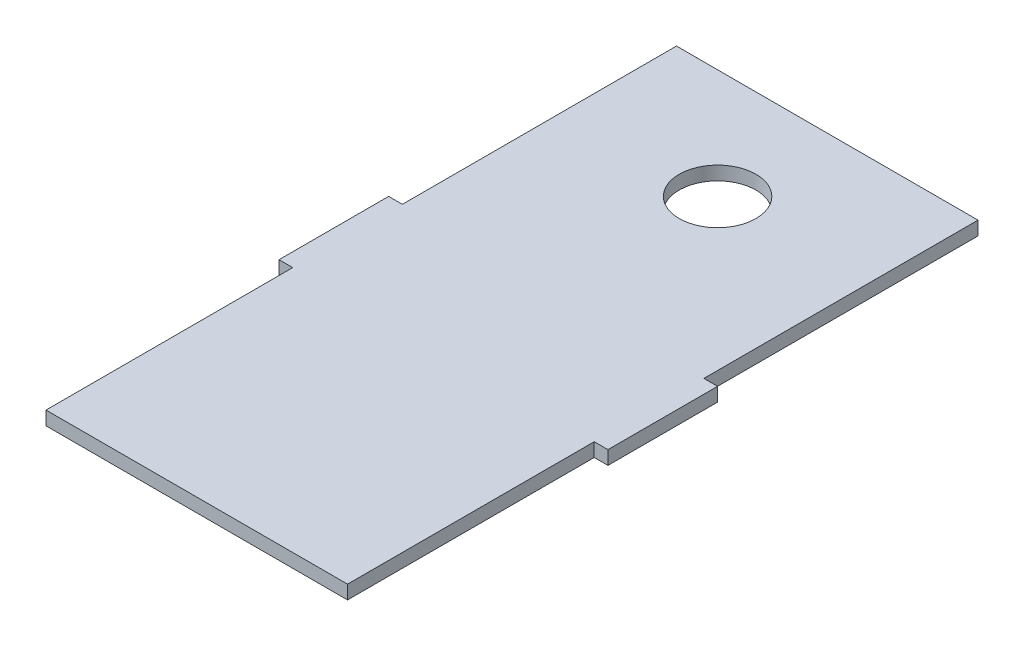
ISO-10303-21;
HEADER;
FILE_DESCRIPTION(('STEP AP214'),'2;1');
FILE_NAME('part.step','',(''),(''),'','','');
FILE_SCHEMA(('AUTOMOTIVE_DESIGN { 1 0 10303 214 1 1 1 1 }'));
ENDSEC;
DATA;
#1=APPLICATION_CONTEXT('core data for automotive mechanical design processes');
#2=APPLICATION_PROTOCOL_DEFINITION('international standard','automotive_design',2000,#1);
#3=PRODUCT_CONTEXT('',#1,'mechanical');
#4=PRODUCT('Part','Part','',(#3));
#5=PRODUCT_RELATED_PRODUCT_CATEGORY('part','',(#4));
#6=PRODUCT_DEFINITION_FORMATION('','',#4);
#7=PRODUCT_DEFINITION_CONTEXT('part definition',#1,'design');
#8=PRODUCT_DEFINITION('design','',#6,#7);
#9=PRODUCT_DEFINITION_SHAPE('','',#8);
#10=(LENGTH_UNIT() NAMED_UNIT(*) SI_UNIT(.MILLI.,.METRE.));
#11=(NAMED_UNIT(*) PLANE_ANGLE_UNIT() SI_UNIT($,.RADIAN.));
#12=(NAMED_UNIT(*) SI_UNIT($,.STERADIAN.) SOLID_ANGLE_UNIT());
#13=UNCERTAINTY_MEASURE_WITH_UNIT(LENGTH_MEASURE(1.E-05),#10,'distance_accuracy_value','');
#14=(GEOMETRIC_REPRESENTATION_CONTEXT(3) GLOBAL_UNCERTAINTY_ASSIGNED_CONTEXT((#13)) GLOBAL_UNIT_ASSIGNED_CONTEXT((#10,
#11,#12)) REPRESENTATION_CONTEXT('',''));
#15=CARTESIAN_POINT('',(0.,0.,0.));
#16=DIRECTION('',(0.,0.,1.));
#17=DIRECTION('',(1.,0.,0.));
#18=AXIS2_PLACEMENT_3D('',#15,#16,#17);
#19=CARTESIAN_POINT('',(0.,3.175,0.));
#20=DIRECTION('',(0.,-1.,0.));
#21=DIRECTION('',(0.,0.,-1.));
#22=AXIS2_PLACEMENT_3D('',#19,#20,#21);
#23=PLANE('',#22);
#24=DIRECTION('',(1.,0.,0.));
#25=VECTOR('',#24,1.);
#26=CARTESIAN_POINT('',(0.,3.175,0.));
#27=LINE('',#26,#25);
#28=CARTESIAN_POINT('',(3.175,3.175,0.));
#29=VERTEX_POINT('',#28);
#30=CARTESIAN_POINT('',(73.025,3.175,0.));
#31=VERTEX_POINT('',#30);
#32=EDGE_CURVE('E214',#29,#31,#27,.T.);
#33=ORIENTED_EDGE('',*,*,#32,.T.);
#34=DIRECTION('',(0.,0.,1.));
#35=VECTOR('',#34,1.);
#36=CARTESIAN_POINT('',(73.025,3.175,0.));
#37=LINE('',#36,#35);
#38=CARTESIAN_POINT('',(73.025,3.175,-57.15));
#39=VERTEX_POINT('',#38);
#40=EDGE_CURVE('E144',#39,#31,#37,.T.);
#41=ORIENTED_EDGE('',*,*,#40,.F.);
#42=DIRECTION('',(-1.,0.,0.));
#43=VECTOR('',#42,1.);
#44=CARTESIAN_POINT('',(76.2,3.175,-57.15));
#45=LINE('',#44,#43);
#46=CARTESIAN_POINT('',(76.2,3.175,-57.15));
#47=VERTEX_POINT('',#46);
#48=EDGE_CURVE('E125',#47,#39,#45,.T.);
#49=ORIENTED_EDGE('',*,*,#48,.F.);
#50=DIRECTION('',(0.,0.,-1.));
#51=VECTOR('',#50,1.);
#52=CARTESIAN_POINT('',(76.2,3.175,0.));
#53=LINE('',#52,#51);
#54=CARTESIAN_POINT('',(76.2,3.175,-82.55));
#55=VERTEX_POINT('',#54);
#56=EDGE_CURVE('E42',#47,#55,#53,.T.);
#57=ORIENTED_EDGE('',*,*,#56,.T.);
#58=DIRECTION('',(1.,0.,0.));
#59=VECTOR('',#58,1.);
#60=CARTESIAN_POINT('',(76.2,3.175,-82.55));
#61=LINE('',#60,#59);
#62=CARTESIAN_POINT('',(73.025,3.175,-82.55));
#63=VERTEX_POINT('',#62);
#64=EDGE_CURVE('E154',#63,#55,#61,.T.);
#65=ORIENTED_EDGE('',*,*,#64,.F.);
#66=DIRECTION('',(0.,0.,1.));
#67=VECTOR('',#66,1.);
#68=CARTESIAN_POINT('',(73.025,3.175,-146.05));
#69=LINE('',#68,#67);
#70=CARTESIAN_POINT('',(73.025,3.175,-146.05));
#71=VERTEX_POINT('',#70);
#72=EDGE_CURVE('E149',#71,#63,#69,.T.);
#73=ORIENTED_EDGE('',*,*,#72,.F.);
#74=DIRECTION('',(-1.,0.,0.));
#75=VECTOR('',#74,1.);
#76=CARTESIAN_POINT('',(0.,3.175,-146.05));
#77=LINE('',#76,#75);
#78=CARTESIAN_POINT('',(3.17500000000001,3.175,-146.05));
#79=VERTEX_POINT('',#78);
#80=EDGE_CURVE('E11',#71,#79,#77,.T.);
#81=ORIENTED_EDGE('',*,*,#80,.T.);
#82=DIRECTION('',(0.,0.,-1.));
#83=VECTOR('',#82,1.);
#84=CARTESIAN_POINT('',(3.175,3.175,-146.05));
#85=LINE('',#84,#83);
#86=CARTESIAN_POINT('',(3.17500000000001,3.175,-82.55));
#87=VERTEX_POINT('',#86);
#88=EDGE_CURVE('E172',#87,#79,#85,.T.);
#89=ORIENTED_EDGE('',*,*,#88,.F.);
#90=DIRECTION('',(1.,0.,0.));
#91=VECTOR('',#90,1.);
#92=CARTESIAN_POINT('',(0.,3.175,-82.55));
#93=LINE('',#92,#91);
#94=CARTESIAN_POINT('',(0.,3.175,-82.55));
#95=VERTEX_POINT('',#94);
#96=EDGE_CURVE('E164',#95,#87,#93,.T.);
#97=ORIENTED_EDGE('',*,*,#96,.F.);
#98=DIRECTION('',(0.,0.,1.));
#99=VECTOR('',#98,1.);
#100=CARTESIAN_POINT('',(0.,3.175,0.));
#101=LINE('',#100,#99);
#102=CARTESIAN_POINT('',(0.,3.175,-57.15));
#103=VERTEX_POINT('',#102);
#104=EDGE_CURVE('E212',#95,#103,#101,.T.);
#105=ORIENTED_EDGE('',*,*,#104,.T.);
#106=DIRECTION('',(-1.,0.,0.));
#107=VECTOR('',#106,1.);
#108=CARTESIAN_POINT('',(0.,3.175,-57.15));
#109=LINE('',#108,#107);
#110=CARTESIAN_POINT('',(3.175,3.175,-57.15));
#111=VERTEX_POINT('',#110);
#112=EDGE_CURVE('E191',#111,#103,#109,.T.);
#113=ORIENTED_EDGE('',*,*,#112,.F.);
#114=DIRECTION('',(0.,0.,-1.));
#115=VECTOR('',#114,1.);
#116=CARTESIAN_POINT('',(3.175,3.175,0.));
#117=LINE('',#116,#115);
#118=EDGE_CURVE('E183',#29,#111,#117,.T.);
#119=ORIENTED_EDGE('',*,*,#118,.F.);
#120=EDGE_LOOP('',(#33,#41,#49,#57,#65,#73,#81,#89,#97,#105,#113,#119));
#121=FACE_BOUND('',#120,.T.);
#122=CARTESIAN_POINT('',(38.1,3.175,-120.65));
#123=DIRECTION('',(0.,1.,0.));
#124=DIRECTION('',(0.,0.,1.));
#125=AXIS2_PLACEMENT_3D('',#122,#123,#124);
#126=CIRCLE('',#125,8.88999999999999);
#127=CARTESIAN_POINT('',(38.1,3.175,-111.76));
#128=VERTEX_POINT('',#127);
#129=EDGE_CURVE('E206',#128,#128,#126,.T.);
#130=ORIENTED_EDGE('',*,*,#129,.F.);
#131=EDGE_LOOP('',(#130));
#132=FACE_BOUND('',#131,.T.);
#133=ADVANCED_FACE('F33',(#121,#132),#23,.F.);
#134=CARTESIAN_POINT('',(0.,0.,0.));
#135=DIRECTION('',(0.,-1.,0.));
#136=DIRECTION('',(0.,0.,-1.));
#137=AXIS2_PLACEMENT_3D('',#134,#135,#136);
#138=PLANE('',#137);
#139=DIRECTION('',(0.,0.,1.));
#140=VECTOR('',#139,1.);
#141=CARTESIAN_POINT('',(73.025,0.,0.));
#142=LINE('',#141,#140);
#143=CARTESIAN_POINT('',(73.025,0.,-57.15));
#144=VERTEX_POINT('',#143);
#145=CARTESIAN_POINT('',(73.025,0.,0.));
#146=VERTEX_POINT('',#145);
#147=EDGE_CURVE('E132',#144,#146,#142,.T.);
#148=ORIENTED_EDGE('',*,*,#147,.T.);
#149=DIRECTION('',(1.,0.,0.));
#150=VECTOR('',#149,1.);
#151=CARTESIAN_POINT('',(0.,0.,0.));
#152=LINE('',#151,#150);
#153=CARTESIAN_POINT('',(3.175,0.,0.));
#154=VERTEX_POINT('',#153);
#155=EDGE_CURVE('E219',#154,#146,#152,.T.);
#156=ORIENTED_EDGE('',*,*,#155,.F.);
#157=DIRECTION('',(0.,0.,-1.));
#158=VECTOR('',#157,1.);
#159=CARTESIAN_POINT('',(3.175,0.,0.));
#160=LINE('',#159,#158);
#161=CARTESIAN_POINT('',(3.175,0.,-57.15));
#162=VERTEX_POINT('',#161);
#163=EDGE_CURVE('E187',#154,#162,#160,.T.);
#164=ORIENTED_EDGE('',*,*,#163,.T.);
#165=DIRECTION('',(-1.,0.,0.));
#166=VECTOR('',#165,1.);
#167=CARTESIAN_POINT('',(0.,0.,-57.15));
#168=LINE('',#167,#166);
#169=CARTESIAN_POINT('',(0.,0.,-57.15));
#170=VERTEX_POINT('',#169);
#171=EDGE_CURVE('E190',#162,#170,#168,.T.);
#172=ORIENTED_EDGE('',*,*,#171,.T.);
#173=DIRECTION('',(0.,0.,1.));
#174=VECTOR('',#173,1.);
#175=CARTESIAN_POINT('',(0.,0.,0.));
#176=LINE('',#175,#174);
#177=CARTESIAN_POINT('',(0.,0.,-82.55));
#178=VERTEX_POINT('',#177);
#179=EDGE_CURVE('E209',#178,#170,#176,.T.);
#180=ORIENTED_EDGE('',*,*,#179,.F.);
#181=DIRECTION('',(1.,0.,0.));
#182=VECTOR('',#181,1.);
#183=CARTESIAN_POINT('',(0.,0.,-82.55));
#184=LINE('',#183,#182);
#185=CARTESIAN_POINT('',(3.17500000000001,0.,-82.55));
#186=VERTEX_POINT('',#185);
#187=EDGE_CURVE('E168',#178,#186,#184,.T.);
#188=ORIENTED_EDGE('',*,*,#187,.T.);
#189=DIRECTION('',(0.,0.,-1.));
#190=VECTOR('',#189,1.);
#191=CARTESIAN_POINT('',(3.175,0.,-146.05));
#192=LINE('',#191,#190);
#193=CARTESIAN_POINT('',(3.175,0.,-146.05));
#194=VERTEX_POINT('',#193);
#195=EDGE_CURVE('E171',#186,#194,#192,.T.);
#196=ORIENTED_EDGE('',*,*,#195,.T.);
#197=DIRECTION('',(-1.,0.,0.));
#198=VECTOR('',#197,1.);
#199=CARTESIAN_POINT('',(0.,0.,-146.05));
#200=LINE('',#199,#198);
#201=CARTESIAN_POINT('',(73.025,0.,-146.05));
#202=VERTEX_POINT('',#201);
#203=EDGE_CURVE('E37',#202,#194,#200,.T.);
#204=ORIENTED_EDGE('',*,*,#203,.F.);
#205=DIRECTION('',(0.,0.,1.));
#206=VECTOR('',#205,1.);
#207=CARTESIAN_POINT('',(73.025,0.,-146.05));
#208=LINE('',#207,#206);
#209=CARTESIAN_POINT('',(73.025,0.,-82.55));
#210=VERTEX_POINT('',#209);
#211=EDGE_CURVE('E58',#202,#210,#208,.T.);
#212=ORIENTED_EDGE('',*,*,#211,.T.);
#213=DIRECTION('',(1.,0.,0.));
#214=VECTOR('',#213,1.);
#215=CARTESIAN_POINT('',(76.2,0.,-82.55));
#216=LINE('',#215,#214);
#217=CARTESIAN_POINT('',(76.2,0.,-82.55));
#218=VERTEX_POINT('',#217);
#219=EDGE_CURVE('E153',#210,#218,#216,.T.);
#220=ORIENTED_EDGE('',*,*,#219,.T.);
#221=DIRECTION('',(0.,0.,-1.));
#222=VECTOR('',#221,1.);
#223=CARTESIAN_POINT('',(76.2,0.,0.));
#224=LINE('',#223,#222);
#225=CARTESIAN_POINT('',(76.2,0.,-57.15));
#226=VERTEX_POINT('',#225);
#227=EDGE_CURVE('E143',#226,#218,#224,.T.);
#228=ORIENTED_EDGE('',*,*,#227,.F.);
#229=DIRECTION('',(-1.,0.,0.));
#230=VECTOR('',#229,1.);
#231=CARTESIAN_POINT('',(76.2,0.,-57.15));
#232=LINE('',#231,#230);
#233=EDGE_CURVE('E50',#226,#144,#232,.T.);
#234=ORIENTED_EDGE('',*,*,#233,.T.);
#235=EDGE_LOOP('',(#148,#156,#164,#172,#180,#188,#196,#204,#212,#220,#228,#234));
#236=FACE_BOUND('',#235,.T.);
#237=CARTESIAN_POINT('',(38.1,0.,-120.65));
#238=DIRECTION('',(0.,1.,0.));
#239=DIRECTION('',(0.,0.,1.));
#240=AXIS2_PLACEMENT_3D('',#237,#238,#239);
#241=CIRCLE('',#240,8.88999999999999);
#242=CARTESIAN_POINT('',(38.1,0.,-111.76));
#243=VERTEX_POINT('',#242);
#244=EDGE_CURVE('E202',#243,#243,#241,.T.);
#245=ORIENTED_EDGE('',*,*,#244,.T.);
#246=EDGE_LOOP('',(#245));
#247=FACE_BOUND('',#246,.T.);
#248=ADVANCED_FACE('F140',(#236,#247),#138,.T.);
#249=CARTESIAN_POINT('',(0.,3.175,0.));
#250=DIRECTION('',(1.,0.,0.));
#251=DIRECTION('',(0.,0.,-1.));
#252=AXIS2_PLACEMENT_3D('',#249,#250,#251);
#253=PLANE('',#252);
#254=ORIENTED_EDGE('',*,*,#104,.F.);
#255=DIRECTION('',(0.,1.,0.));
#256=VECTOR('',#255,1.);
#257=CARTESIAN_POINT('',(0.,0.,-82.55));
#258=LINE('',#257,#256);
#259=EDGE_CURVE('E175',#178,#95,#258,.T.);
#260=ORIENTED_EDGE('',*,*,#259,.F.);
#261=ORIENTED_EDGE('',*,*,#179,.T.);
#262=DIRECTION('',(0.,1.,0.));
#263=VECTOR('',#262,1.);
#264=CARTESIAN_POINT('',(0.,0.,-57.15));
#265=LINE('',#264,#263);
#266=EDGE_CURVE('E199',#170,#103,#265,.T.);
#267=ORIENTED_EDGE('',*,*,#266,.T.);
#268=EDGE_LOOP('',(#254,#260,#261,#267));
#269=FACE_BOUND('',#268,.T.);
#270=ADVANCED_FACE('F35',(#269),#253,.F.);
#271=CARTESIAN_POINT('',(0.,3.175,0.));
#272=DIRECTION('',(0.,0.,-1.));
#273=DIRECTION('',(-1.,0.,0.));
#274=AXIS2_PLACEMENT_3D('',#271,#272,#273);
#275=PLANE('',#274);
#276=ORIENTED_EDGE('',*,*,#155,.T.);
#277=DIRECTION('',(0.,1.,0.));
#278=VECTOR('',#277,1.);
#279=CARTESIAN_POINT('',(73.025,0.,0.));
#280=LINE('',#279,#278);
#281=EDGE_CURVE('E128',#146,#31,#280,.T.);
#282=ORIENTED_EDGE('',*,*,#281,.T.);
#283=ORIENTED_EDGE('',*,*,#32,.F.);
#284=DIRECTION('',(0.,1.,0.));
#285=VECTOR('',#284,1.);
#286=CARTESIAN_POINT('',(3.175,0.,0.));
#287=LINE('',#286,#285);
#288=EDGE_CURVE('E194',#154,#29,#287,.T.);
#289=ORIENTED_EDGE('',*,*,#288,.F.);
#290=EDGE_LOOP('',(#276,#282,#283,#289));
#291=FACE_BOUND('',#290,.T.);
#292=ADVANCED_FACE('F251',(#291),#275,.F.);
#293=CARTESIAN_POINT('',(76.2,3.175,0.));
#294=DIRECTION('',(-1.,0.,0.));
#295=DIRECTION('',(0.,0.,1.));
#296=AXIS2_PLACEMENT_3D('',#293,#294,#295);
#297=PLANE('',#296);
#298=ORIENTED_EDGE('',*,*,#56,.F.);
#299=DIRECTION('',(0.,1.,0.));
#300=VECTOR('',#299,1.);
#301=CARTESIAN_POINT('',(76.2,0.,-57.15));
#302=LINE('',#301,#300);
#303=EDGE_CURVE('E129',#226,#47,#302,.T.);
#304=ORIENTED_EDGE('',*,*,#303,.F.);
#305=ORIENTED_EDGE('',*,*,#227,.T.);
#306=DIRECTION('',(0.,1.,0.));
#307=VECTOR('',#306,1.);
#308=CARTESIAN_POINT('',(76.2,0.,-82.55));
#309=LINE('',#308,#307);
#310=EDGE_CURVE('E161',#218,#55,#309,.T.);
#311=ORIENTED_EDGE('',*,*,#310,.T.);
#312=EDGE_LOOP('',(#298,#304,#305,#311));
#313=FACE_BOUND('',#312,.T.);
#314=ADVANCED_FACE('F253',(#313),#297,.F.);
#315=CARTESIAN_POINT('',(0.,3.175,-146.05));
#316=DIRECTION('',(0.,0.,1.));
#317=DIRECTION('',(1.,0.,0.));
#318=AXIS2_PLACEMENT_3D('',#315,#316,#317);
#319=PLANE('',#318);
#320=ORIENTED_EDGE('',*,*,#80,.F.);
#321=DIRECTION('',(0.,1.,0.));
#322=VECTOR('',#321,1.);
#323=CARTESIAN_POINT('',(73.025,0.,-146.05));
#324=LINE('',#323,#322);
#325=EDGE_CURVE('E156',#202,#71,#324,.T.);
#326=ORIENTED_EDGE('',*,*,#325,.F.);
#327=ORIENTED_EDGE('',*,*,#203,.T.);
#328=DIRECTION('',(0.,1.,0.));
#329=VECTOR('',#328,1.);
#330=CARTESIAN_POINT('',(3.175,0.,-146.05));
#331=LINE('',#330,#329);
#332=EDGE_CURVE('E180',#194,#79,#331,.T.);
#333=ORIENTED_EDGE('',*,*,#332,.T.);
#334=EDGE_LOOP('',(#320,#326,#327,#333));
#335=FACE_BOUND('',#334,.T.);
#336=ADVANCED_FACE('F226',(#335),#319,.F.);
#337=CARTESIAN_POINT('',(38.1,3.175,-120.65));
#338=DIRECTION('',(0.,-1.,0.));
#339=DIRECTION('',(0.,0.,-1.));
#340=AXIS2_PLACEMENT_3D('',#337,#338,#339);
#341=CYLINDRICAL_SURFACE('',#340,8.88999999999999);
#342=ORIENTED_EDGE('',*,*,#129,.T.);
#343=EDGE_LOOP('',(#342));
#344=FACE_BOUND('',#343,.T.);
#345=ORIENTED_EDGE('',*,*,#244,.F.);
#346=EDGE_LOOP('',(#345));
#347=FACE_BOUND('',#346,.T.);
#348=ADVANCED_FACE('F267',(#344,#347),#341,.F.);
#349=CARTESIAN_POINT('',(0.,0.,-57.15));
#350=DIRECTION('',(0.,0.,-1.));
#351=DIRECTION('',(-1.,0.,0.));
#352=AXIS2_PLACEMENT_3D('',#349,#350,#351);
#353=PLANE('',#352);
#354=ORIENTED_EDGE('',*,*,#112,.T.);
#355=ORIENTED_EDGE('',*,*,#266,.F.);
#356=ORIENTED_EDGE('',*,*,#171,.F.);
#357=DIRECTION('',(0.,1.,0.));
#358=VECTOR('',#357,1.);
#359=CARTESIAN_POINT('',(3.175,0.,-57.15));
#360=LINE('',#359,#358);
#361=EDGE_CURVE('E203',#162,#111,#360,.T.);
#362=ORIENTED_EDGE('',*,*,#361,.T.);
#363=EDGE_LOOP('',(#354,#355,#356,#362));
#364=FACE_BOUND('',#363,.T.);
#365=ADVANCED_FACE('F244',(#364),#353,.F.);
#366=CARTESIAN_POINT('',(3.175,0.,0.));
#367=DIRECTION('',(1.,0.,0.));
#368=DIRECTION('',(0.,0.,-1.));
#369=AXIS2_PLACEMENT_3D('',#366,#367,#368);
#370=PLANE('',#369);
#371=ORIENTED_EDGE('',*,*,#118,.T.);
#372=ORIENTED_EDGE('',*,*,#361,.F.);
#373=ORIENTED_EDGE('',*,*,#163,.F.);
#374=ORIENTED_EDGE('',*,*,#288,.T.);
#375=EDGE_LOOP('',(#371,#372,#373,#374));
#376=FACE_BOUND('',#375,.T.);
#377=ADVANCED_FACE('F247',(#376),#370,.F.);
#378=CARTESIAN_POINT('',(3.175,0.,-146.05));
#379=DIRECTION('',(1.,0.,0.));
#380=DIRECTION('',(0.,0.,-1.));
#381=AXIS2_PLACEMENT_3D('',#378,#379,#380);
#382=PLANE('',#381);
#383=ORIENTED_EDGE('',*,*,#88,.T.);
#384=ORIENTED_EDGE('',*,*,#332,.F.);
#385=ORIENTED_EDGE('',*,*,#195,.F.);
#386=DIRECTION('',(0.,1.,0.));
#387=VECTOR('',#386,1.);
#388=CARTESIAN_POINT('',(3.17500000000001,0.,-82.55));
#389=LINE('',#388,#387);
#390=EDGE_CURVE('E184',#186,#87,#389,.T.);
#391=ORIENTED_EDGE('',*,*,#390,.T.);
#392=EDGE_LOOP('',(#383,#384,#385,#391));
#393=FACE_BOUND('',#392,.T.);
#394=ADVANCED_FACE('F229',(#393),#382,.F.);
#395=CARTESIAN_POINT('',(0.,0.,-82.55));
#396=DIRECTION('',(0.,0.,1.));
#397=DIRECTION('',(1.,0.,0.));
#398=AXIS2_PLACEMENT_3D('',#395,#396,#397);
#399=PLANE('',#398);
#400=ORIENTED_EDGE('',*,*,#96,.T.);
#401=ORIENTED_EDGE('',*,*,#390,.F.);
#402=ORIENTED_EDGE('',*,*,#187,.F.);
#403=ORIENTED_EDGE('',*,*,#259,.T.);
#404=EDGE_LOOP('',(#400,#401,#402,#403));
#405=FACE_BOUND('',#404,.T.);
#406=ADVANCED_FACE('F234',(#405),#399,.F.);
#407=CARTESIAN_POINT('',(76.2,0.,-82.55));
#408=DIRECTION('',(0.,0.,1.));
#409=DIRECTION('',(1.,0.,0.));
#410=AXIS2_PLACEMENT_3D('',#407,#408,#409);
#411=PLANE('',#410);
#412=ORIENTED_EDGE('',*,*,#64,.T.);
#413=ORIENTED_EDGE('',*,*,#310,.F.);
#414=ORIENTED_EDGE('',*,*,#219,.F.);
#415=DIRECTION('',(0.,1.,0.));
#416=VECTOR('',#415,1.);
#417=CARTESIAN_POINT('',(73.025,0.,-82.55));
#418=LINE('',#417,#416);
#419=EDGE_CURVE('E165',#210,#63,#418,.T.);
#420=ORIENTED_EDGE('',*,*,#419,.T.);
#421=EDGE_LOOP('',(#412,#413,#414,#420));
#422=FACE_BOUND('',#421,.T.);
#423=ADVANCED_FACE('F287',(#422),#411,.F.);
#424=CARTESIAN_POINT('',(73.025,0.,-146.05));
#425=DIRECTION('',(-1.,0.,0.));
#426=DIRECTION('',(0.,0.,1.));
#427=AXIS2_PLACEMENT_3D('',#424,#425,#426);
#428=PLANE('',#427);
#429=ORIENTED_EDGE('',*,*,#72,.T.);
#430=ORIENTED_EDGE('',*,*,#419,.F.);
#431=ORIENTED_EDGE('',*,*,#211,.F.);
#432=ORIENTED_EDGE('',*,*,#325,.T.);
#433=EDGE_LOOP('',(#429,#430,#431,#432));
#434=FACE_BOUND('',#433,.T.);
#435=ADVANCED_FACE('F290',(#434),#428,.F.);
#436=CARTESIAN_POINT('',(73.025,0.,0.));
#437=DIRECTION('',(-1.,0.,0.));
#438=DIRECTION('',(0.,0.,1.));
#439=AXIS2_PLACEMENT_3D('',#436,#437,#438);
#440=PLANE('',#439);
#441=ORIENTED_EDGE('',*,*,#40,.T.);
#442=ORIENTED_EDGE('',*,*,#281,.F.);
#443=ORIENTED_EDGE('',*,*,#147,.F.);
#444=DIRECTION('',(0.,1.,0.));
#445=VECTOR('',#444,1.);
#446=CARTESIAN_POINT('',(73.025,0.,-57.15));
#447=LINE('',#446,#445);
#448=EDGE_CURVE('E121',#144,#39,#447,.T.);
#449=ORIENTED_EDGE('',*,*,#448,.T.);
#450=EDGE_LOOP('',(#441,#442,#443,#449));
#451=FACE_BOUND('',#450,.T.);
#452=ADVANCED_FACE('F133',(#451),#440,.F.);
#453=CARTESIAN_POINT('',(76.2,0.,-57.15));
#454=DIRECTION('',(0.,0.,-1.));
#455=DIRECTION('',(-1.,0.,0.));
#456=AXIS2_PLACEMENT_3D('',#453,#454,#455);
#457=PLANE('',#456);
#458=ORIENTED_EDGE('',*,*,#48,.T.);
#459=ORIENTED_EDGE('',*,*,#448,.F.);
#460=ORIENTED_EDGE('',*,*,#233,.F.);
#461=ORIENTED_EDGE('',*,*,#303,.T.);
#462=EDGE_LOOP('',(#458,#459,#460,#461));
#463=FACE_BOUND('',#462,.T.);
#464=ADVANCED_FACE('F123',(#463),#457,.F.);
#465=CLOSED_SHELL('',(#133,#248,#270,#292,#314,#336,#348,#365,#377,#394,#406,#423,#435,#452,#464));
#466=MANIFOLD_SOLID_BREP('B2',#465);
#467=ADVANCED_BREP_SHAPE_REPRESENTATION('',(#18,#466),#14);
#468=SHAPE_DEFINITION_REPRESENTATION(#9,#467);
ENDSEC;
END-ISO-10303-21;
